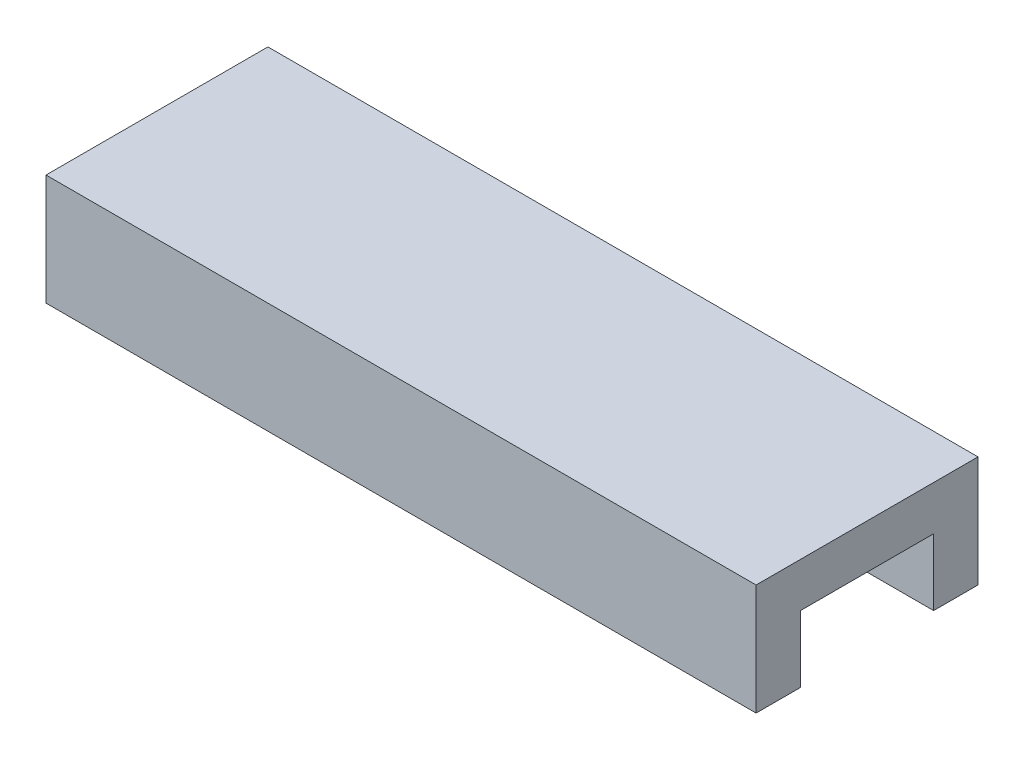
ISO-10303-21;
HEADER;
FILE_DESCRIPTION(('STEP AP214'),'2;1');
FILE_NAME('part.step','',(''),(''),'','','');
FILE_SCHEMA(('AUTOMOTIVE_DESIGN { 1 0 10303 214 1 1 1 1 }'));
ENDSEC;
DATA;
#1=APPLICATION_CONTEXT('core data for automotive mechanical design processes');
#2=APPLICATION_PROTOCOL_DEFINITION('international standard','automotive_design',2000,#1);
#3=PRODUCT_CONTEXT('',#1,'mechanical');
#4=PRODUCT('Part','Part','',(#3));
#5=PRODUCT_RELATED_PRODUCT_CATEGORY('part','',(#4));
#6=PRODUCT_DEFINITION_FORMATION('','',#4);
#7=PRODUCT_DEFINITION_CONTEXT('part definition',#1,'design');
#8=PRODUCT_DEFINITION('design','',#6,#7);
#9=PRODUCT_DEFINITION_SHAPE('','',#8);
#10=(LENGTH_UNIT() NAMED_UNIT(*) SI_UNIT(.MILLI.,.METRE.));
#11=(NAMED_UNIT(*) PLANE_ANGLE_UNIT() SI_UNIT($,.RADIAN.));
#12=(NAMED_UNIT(*) SI_UNIT($,.STERADIAN.) SOLID_ANGLE_UNIT());
#13=UNCERTAINTY_MEASURE_WITH_UNIT(LENGTH_MEASURE(1.E-05),#10,'distance_accuracy_value','');
#14=(GEOMETRIC_REPRESENTATION_CONTEXT(3) GLOBAL_UNCERTAINTY_ASSIGNED_CONTEXT((#13)) GLOBAL_UNIT_ASSIGNED_CONTEXT((#10,
#11,#12)) REPRESENTATION_CONTEXT('',''));
#15=CARTESIAN_POINT('',(0.,0.,0.));
#16=DIRECTION('',(0.,0.,1.));
#17=DIRECTION('',(1.,0.,0.));
#18=AXIS2_PLACEMENT_3D('',#15,#16,#17);
#19=CARTESIAN_POINT('',(160.,0.,9.92816091954025));
#20=DIRECTION('',(0.,1.,0.));
#21=DIRECTION('',(0.,0.,1.));
#22=AXIS2_PLACEMENT_3D('',#19,#20,#21);
#23=PLANE('',#22);
#24=DIRECTION('',(0.,0.,-1.));
#25=VECTOR('',#24,1.);
#26=CARTESIAN_POINT('',(0.,0.,9.92816091954025));
#27=LINE('',#26,#25);
#28=CARTESIAN_POINT('',(0.,0.,19.9281609195402));
#29=VERTEX_POINT('',#28);
#30=CARTESIAN_POINT('',(0.,0.,9.92816091954025));
#31=VERTEX_POINT('',#30);
#32=EDGE_CURVE('E127',#29,#31,#27,.T.);
#33=ORIENTED_EDGE('',*,*,#32,.T.);
#34=DIRECTION('',(-1.,0.,0.));
#35=VECTOR('',#34,1.);
#36=CARTESIAN_POINT('',(160.,0.,9.92816091954025));
#37=LINE('',#36,#35);
#38=CARTESIAN_POINT('',(160.,0.,9.92816091954025));
#39=VERTEX_POINT('',#38);
#40=EDGE_CURVE('E11',#39,#31,#37,.T.);
#41=ORIENTED_EDGE('',*,*,#40,.F.);
#42=DIRECTION('',(0.,0.,-1.));
#43=VECTOR('',#42,1.);
#44=CARTESIAN_POINT('',(160.,0.,9.92816091954025));
#45=LINE('',#44,#43);
#46=CARTESIAN_POINT('',(160.,0.,19.9281609195402));
#47=VERTEX_POINT('',#46);
#48=EDGE_CURVE('E141',#47,#39,#45,.T.);
#49=ORIENTED_EDGE('',*,*,#48,.F.);
#50=DIRECTION('',(-1.,0.,0.));
#51=VECTOR('',#50,1.);
#52=CARTESIAN_POINT('',(160.,0.,19.9281609195402));
#53=LINE('',#52,#51);
#54=EDGE_CURVE('E123',#47,#29,#53,.T.);
#55=ORIENTED_EDGE('',*,*,#54,.T.);
#56=EDGE_LOOP('',(#33,#41,#49,#55));
#57=FACE_BOUND('',#56,.T.);
#58=ADVANCED_FACE('F31',(#57),#23,.F.);
#59=CARTESIAN_POINT('',(160.,15.,9.92816091954024));
#60=DIRECTION('',(0.,0.,1.));
#61=DIRECTION('',(0.,-1.,0.));
#62=AXIS2_PLACEMENT_3D('',#59,#60,#61);
#63=PLANE('',#62);
#64=DIRECTION('',(0.,1.,0.));
#65=VECTOR('',#64,1.);
#66=CARTESIAN_POINT('',(0.,15.,9.92816091954024));
#67=LINE('',#66,#65);
#68=CARTESIAN_POINT('',(0.,15.,9.92816091954024));
#69=VERTEX_POINT('',#68);
#70=EDGE_CURVE('E130',#31,#69,#67,.T.);
#71=ORIENTED_EDGE('',*,*,#70,.T.);
#72=DIRECTION('',(-1.,0.,0.));
#73=VECTOR('',#72,1.);
#74=CARTESIAN_POINT('',(160.,15.,9.92816091954024));
#75=LINE('',#74,#73);
#76=CARTESIAN_POINT('',(160.,15.,9.92816091954024));
#77=VERTEX_POINT('',#76);
#78=EDGE_CURVE('E39',#77,#69,#75,.T.);
#79=ORIENTED_EDGE('',*,*,#78,.F.);
#80=DIRECTION('',(0.,1.,0.));
#81=VECTOR('',#80,1.);
#82=CARTESIAN_POINT('',(160.,15.,9.92816091954024));
#83=LINE('',#82,#81);
#84=EDGE_CURVE('E90',#39,#77,#83,.T.);
#85=ORIENTED_EDGE('',*,*,#84,.F.);
#86=ORIENTED_EDGE('',*,*,#40,.T.);
#87=EDGE_LOOP('',(#71,#79,#85,#86));
#88=FACE_BOUND('',#87,.T.);
#89=ADVANCED_FACE('F176',(#88),#63,.F.);
#90=CARTESIAN_POINT('',(160.,15.,-20.0718390804598));
#91=DIRECTION('',(0.,1.,0.));
#92=DIRECTION('',(0.,0.,1.));
#93=AXIS2_PLACEMENT_3D('',#90,#91,#92);
#94=PLANE('',#93);
#95=DIRECTION('',(0.,0.,-1.));
#96=VECTOR('',#95,1.);
#97=CARTESIAN_POINT('',(0.,15.,-20.0718390804598));
#98=LINE('',#97,#96);
#99=CARTESIAN_POINT('',(0.,15.,-20.0718390804598));
#100=VERTEX_POINT('',#99);
#101=EDGE_CURVE('E132',#69,#100,#98,.T.);
#102=ORIENTED_EDGE('',*,*,#101,.T.);
#103=DIRECTION('',(-1.,0.,0.));
#104=VECTOR('',#103,1.);
#105=CARTESIAN_POINT('',(160.,15.,-20.0718390804598));
#106=LINE('',#105,#104);
#107=CARTESIAN_POINT('',(160.,15.,-20.0718390804598));
#108=VERTEX_POINT('',#107);
#109=EDGE_CURVE('E148',#108,#100,#106,.T.);
#110=ORIENTED_EDGE('',*,*,#109,.F.);
#111=DIRECTION('',(0.,0.,-1.));
#112=VECTOR('',#111,1.);
#113=CARTESIAN_POINT('',(160.,15.,-20.0718390804598));
#114=LINE('',#113,#112);
#115=EDGE_CURVE('E156',#77,#108,#114,.T.);
#116=ORIENTED_EDGE('',*,*,#115,.F.);
#117=ORIENTED_EDGE('',*,*,#78,.T.);
#118=EDGE_LOOP('',(#102,#110,#116,#117));
#119=FACE_BOUND('',#118,.T.);
#120=ADVANCED_FACE('F154',(#119),#94,.F.);
#121=CARTESIAN_POINT('',(160.,0.,-20.0718390804598));
#122=DIRECTION('',(0.,0.,-1.));
#123=DIRECTION('',(-1.,0.,0.));
#124=AXIS2_PLACEMENT_3D('',#121,#122,#123);
#125=PLANE('',#124);
#126=DIRECTION('',(0.,-1.,0.));
#127=VECTOR('',#126,1.);
#128=CARTESIAN_POINT('',(0.,0.,-20.0718390804598));
#129=LINE('',#128,#127);
#130=CARTESIAN_POINT('',(0.,0.,-20.0718390804598));
#131=VERTEX_POINT('',#130);
#132=EDGE_CURVE('E134',#100,#131,#129,.T.);
#133=ORIENTED_EDGE('',*,*,#132,.T.);
#134=DIRECTION('',(-1.,0.,0.));
#135=VECTOR('',#134,1.);
#136=CARTESIAN_POINT('',(160.,0.,-20.0718390804598));
#137=LINE('',#136,#135);
#138=CARTESIAN_POINT('',(160.,0.,-20.0718390804598));
#139=VERTEX_POINT('',#138);
#140=EDGE_CURVE('E145',#139,#131,#137,.T.);
#141=ORIENTED_EDGE('',*,*,#140,.F.);
#142=DIRECTION('',(0.,-1.,0.));
#143=VECTOR('',#142,1.);
#144=CARTESIAN_POINT('',(160.,0.,-20.0718390804598));
#145=LINE('',#144,#143);
#146=EDGE_CURVE('E168',#108,#139,#145,.T.);
#147=ORIENTED_EDGE('',*,*,#146,.F.);
#148=ORIENTED_EDGE('',*,*,#109,.T.);
#149=EDGE_LOOP('',(#133,#141,#147,#148));
#150=FACE_BOUND('',#149,.T.);
#151=ADVANCED_FACE('F164',(#150),#125,.F.);
#152=CARTESIAN_POINT('',(160.,0.,-30.0718390804598));
#153=DIRECTION('',(0.,1.,0.));
#154=DIRECTION('',(0.,0.,1.));
#155=AXIS2_PLACEMENT_3D('',#152,#153,#154);
#156=PLANE('',#155);
#157=DIRECTION('',(0.,0.,-1.));
#158=VECTOR('',#157,1.);
#159=CARTESIAN_POINT('',(0.,0.,-30.0718390804598));
#160=LINE('',#159,#158);
#161=CARTESIAN_POINT('',(0.,0.,-30.0718390804598));
#162=VERTEX_POINT('',#161);
#163=EDGE_CURVE('E136',#131,#162,#160,.T.);
#164=ORIENTED_EDGE('',*,*,#163,.T.);
#165=DIRECTION('',(-1.,0.,0.));
#166=VECTOR('',#165,1.);
#167=CARTESIAN_POINT('',(160.,0.,-30.0718390804598));
#168=LINE('',#167,#166);
#169=CARTESIAN_POINT('',(160.,0.,-30.0718390804598));
#170=VERTEX_POINT('',#169);
#171=EDGE_CURVE('E118',#170,#162,#168,.T.);
#172=ORIENTED_EDGE('',*,*,#171,.F.);
#173=DIRECTION('',(0.,0.,-1.));
#174=VECTOR('',#173,1.);
#175=CARTESIAN_POINT('',(160.,0.,-30.0718390804598));
#176=LINE('',#175,#174);
#177=EDGE_CURVE('E109',#139,#170,#176,.T.);
#178=ORIENTED_EDGE('',*,*,#177,.F.);
#179=ORIENTED_EDGE('',*,*,#140,.T.);
#180=EDGE_LOOP('',(#164,#172,#178,#179));
#181=FACE_BOUND('',#180,.T.);
#182=ADVANCED_FACE('F167',(#181),#156,.F.);
#183=CARTESIAN_POINT('',(160.,25.,-30.0718390804598));
#184=DIRECTION('',(0.,0.,1.));
#185=DIRECTION('',(0.,-1.,0.));
#186=AXIS2_PLACEMENT_3D('',#183,#184,#185);
#187=PLANE('',#186);
#188=DIRECTION('',(0.,1.,0.));
#189=VECTOR('',#188,1.);
#190=CARTESIAN_POINT('',(0.,25.,-30.0718390804598));
#191=LINE('',#190,#189);
#192=CARTESIAN_POINT('',(0.,25.,-30.0718390804598));
#193=VERTEX_POINT('',#192);
#194=EDGE_CURVE('E117',#162,#193,#191,.T.);
#195=ORIENTED_EDGE('',*,*,#194,.T.);
#196=DIRECTION('',(-1.,0.,0.));
#197=VECTOR('',#196,1.);
#198=CARTESIAN_POINT('',(160.,25.,-30.0718390804598));
#199=LINE('',#198,#197);
#200=CARTESIAN_POINT('',(160.,25.,-30.0718390804598));
#201=VERTEX_POINT('',#200);
#202=EDGE_CURVE('E114',#201,#193,#199,.T.);
#203=ORIENTED_EDGE('',*,*,#202,.F.);
#204=DIRECTION('',(0.,1.,0.));
#205=VECTOR('',#204,1.);
#206=CARTESIAN_POINT('',(160.,25.,-30.0718390804598));
#207=LINE('',#206,#205);
#208=EDGE_CURVE('E103',#170,#201,#207,.T.);
#209=ORIENTED_EDGE('',*,*,#208,.F.);
#210=ORIENTED_EDGE('',*,*,#171,.T.);
#211=EDGE_LOOP('',(#195,#203,#209,#210));
#212=FACE_BOUND('',#211,.T.);
#213=ADVANCED_FACE('F115',(#212),#187,.F.);
#214=CARTESIAN_POINT('',(160.,25.,19.9281609195403));
#215=DIRECTION('',(0.,-1.,0.));
#216=DIRECTION('',(0.,0.,-1.));
#217=AXIS2_PLACEMENT_3D('',#214,#215,#216);
#218=PLANE('',#217);
#219=DIRECTION('',(0.,0.,1.));
#220=VECTOR('',#219,1.);
#221=CARTESIAN_POINT('',(0.,25.,19.9281609195403));
#222=LINE('',#221,#220);
#223=CARTESIAN_POINT('',(0.,25.,19.9281609195403));
#224=VERTEX_POINT('',#223);
#225=EDGE_CURVE('E76',#193,#224,#222,.T.);
#226=ORIENTED_EDGE('',*,*,#225,.T.);
#227=DIRECTION('',(-1.,0.,0.));
#228=VECTOR('',#227,1.);
#229=CARTESIAN_POINT('',(160.,25.,19.9281609195403));
#230=LINE('',#229,#228);
#231=CARTESIAN_POINT('',(160.,25.,19.9281609195403));
#232=VERTEX_POINT('',#231);
#233=EDGE_CURVE('E119',#232,#224,#230,.T.);
#234=ORIENTED_EDGE('',*,*,#233,.F.);
#235=DIRECTION('',(0.,0.,1.));
#236=VECTOR('',#235,1.);
#237=CARTESIAN_POINT('',(160.,25.,19.9281609195403));
#238=LINE('',#237,#236);
#239=EDGE_CURVE('E107',#201,#232,#238,.T.);
#240=ORIENTED_EDGE('',*,*,#239,.F.);
#241=ORIENTED_EDGE('',*,*,#202,.T.);
#242=EDGE_LOOP('',(#226,#234,#240,#241));
#243=FACE_BOUND('',#242,.T.);
#244=ADVANCED_FACE('F121',(#243),#218,.F.);
#245=CARTESIAN_POINT('',(160.,0.,19.9281609195402));
#246=DIRECTION('',(0.,0.,-1.));
#247=DIRECTION('',(0.,1.,0.));
#248=AXIS2_PLACEMENT_3D('',#245,#246,#247);
#249=PLANE('',#248);
#250=DIRECTION('',(0.,-1.,0.));
#251=VECTOR('',#250,1.);
#252=CARTESIAN_POINT('',(0.,0.,19.9281609195402));
#253=LINE('',#252,#251);
#254=EDGE_CURVE('E82',#224,#29,#253,.T.);
#255=ORIENTED_EDGE('',*,*,#254,.T.);
#256=ORIENTED_EDGE('',*,*,#54,.F.);
#257=DIRECTION('',(0.,-1.,0.));
#258=VECTOR('',#257,1.);
#259=CARTESIAN_POINT('',(160.,0.,19.9281609195402));
#260=LINE('',#259,#258);
#261=EDGE_CURVE('E47',#232,#47,#260,.T.);
#262=ORIENTED_EDGE('',*,*,#261,.F.);
#263=ORIENTED_EDGE('',*,*,#233,.T.);
#264=EDGE_LOOP('',(#255,#256,#262,#263));
#265=FACE_BOUND('',#264,.T.);
#266=ADVANCED_FACE('F192',(#265),#249,.F.);
#267=CARTESIAN_POINT('',(160.,0.,19.9281609195402));
#268=DIRECTION('',(-1.,0.,0.));
#269=DIRECTION('',(0.,0.,1.));
#270=AXIS2_PLACEMENT_3D('',#267,#268,#269);
#271=PLANE('',#270);
#272=ORIENTED_EDGE('',*,*,#48,.T.);
#273=ORIENTED_EDGE('',*,*,#84,.T.);
#274=ORIENTED_EDGE('',*,*,#115,.T.);
#275=ORIENTED_EDGE('',*,*,#146,.T.);
#276=ORIENTED_EDGE('',*,*,#177,.T.);
#277=ORIENTED_EDGE('',*,*,#208,.T.);
#278=ORIENTED_EDGE('',*,*,#239,.T.);
#279=ORIENTED_EDGE('',*,*,#261,.T.);
#280=EDGE_LOOP('',(#272,#273,#274,#275,#276,#277,#278,#279));
#281=FACE_BOUND('',#280,.T.);
#282=ADVANCED_FACE('F105',(#281),#271,.F.);
#283=CARTESIAN_POINT('',(0.,0.,19.9281609195402));
#284=DIRECTION('',(-1.,0.,0.));
#285=DIRECTION('',(0.,0.,1.));
#286=AXIS2_PLACEMENT_3D('',#283,#284,#285);
#287=PLANE('',#286);
#288=ORIENTED_EDGE('',*,*,#32,.F.);
#289=ORIENTED_EDGE('',*,*,#254,.F.);
#290=ORIENTED_EDGE('',*,*,#225,.F.);
#291=ORIENTED_EDGE('',*,*,#194,.F.);
#292=ORIENTED_EDGE('',*,*,#163,.F.);
#293=ORIENTED_EDGE('',*,*,#132,.F.);
#294=ORIENTED_EDGE('',*,*,#101,.F.);
#295=ORIENTED_EDGE('',*,*,#70,.F.);
#296=EDGE_LOOP('',(#288,#289,#290,#291,#292,#293,#294,#295));
#297=FACE_BOUND('',#296,.T.);
#298=ADVANCED_FACE('F160',(#297),#287,.T.);
#299=CLOSED_SHELL('',(#58,#89,#120,#151,#182,#213,#244,#266,#282,#298));
#300=MANIFOLD_SOLID_BREP('B2',#299);
#301=ADVANCED_BREP_SHAPE_REPRESENTATION('',(#18,#300),#14);
#302=SHAPE_DEFINITION_REPRESENTATION(#9,#301);
ENDSEC;
END-ISO-10303-21;
